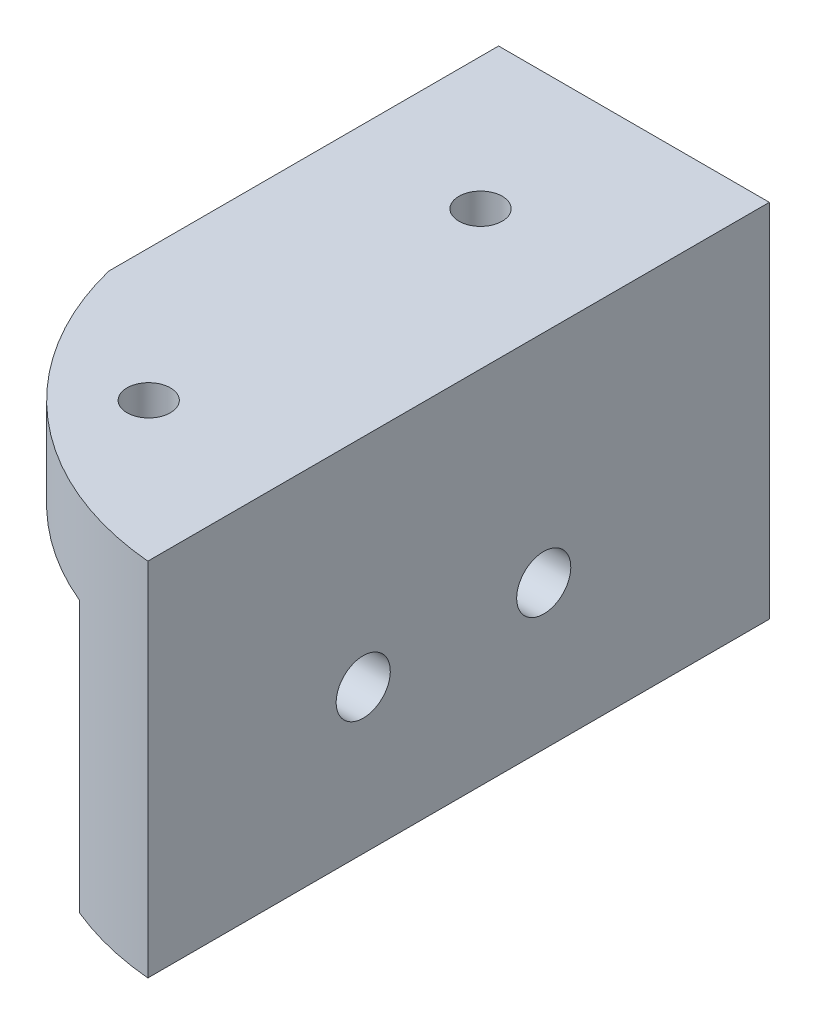
ISO-10303-21;
HEADER;
FILE_DESCRIPTION(('STEP AP214'),'2;1');
FILE_NAME('part.step','',(''),(''),'','','');
FILE_SCHEMA(('AUTOMOTIVE_DESIGN { 1 0 10303 214 1 1 1 1 }'));
ENDSEC;
DATA;
#1=APPLICATION_CONTEXT('core data for automotive mechanical design processes');
#2=APPLICATION_PROTOCOL_DEFINITION('international standard','automotive_design',2000,#1);
#3=PRODUCT_CONTEXT('',#1,'mechanical');
#4=PRODUCT('Part','Part','',(#3));
#5=PRODUCT_RELATED_PRODUCT_CATEGORY('part','',(#4));
#6=PRODUCT_DEFINITION_FORMATION('','',#4);
#7=PRODUCT_DEFINITION_CONTEXT('part definition',#1,'design');
#8=PRODUCT_DEFINITION('design','',#6,#7);
#9=PRODUCT_DEFINITION_SHAPE('','',#8);
#10=(LENGTH_UNIT() NAMED_UNIT(*) SI_UNIT(.MILLI.,.METRE.));
#11=(NAMED_UNIT(*) PLANE_ANGLE_UNIT() SI_UNIT($,.RADIAN.));
#12=(NAMED_UNIT(*) SI_UNIT($,.STERADIAN.) SOLID_ANGLE_UNIT());
#13=UNCERTAINTY_MEASURE_WITH_UNIT(LENGTH_MEASURE(1.E-05),#10,'distance_accuracy_value','');
#14=(GEOMETRIC_REPRESENTATION_CONTEXT(3) GLOBAL_UNCERTAINTY_ASSIGNED_CONTEXT((#13)) GLOBAL_UNIT_ASSIGNED_CONTEXT((#10,
#11,#12)) REPRESENTATION_CONTEXT('',''));
#15=CARTESIAN_POINT('',(0.,0.,0.));
#16=DIRECTION('',(0.,0.,1.));
#17=DIRECTION('',(1.,0.,0.));
#18=AXIS2_PLACEMENT_3D('',#15,#16,#17);
#19=CARTESIAN_POINT('',(5.,0.,35.));
#20=DIRECTION('',(0.,1.,0.));
#21=DIRECTION('',(-1.,0.,0.));
#22=AXIS2_PLACEMENT_3D('',#19,#20,#21);
#23=PLANE('',#22);
#24=DIRECTION('',(1.,0.,0.));
#25=VECTOR('',#24,1.);
#26=CARTESIAN_POINT('',(5.,0.,0.));
#27=LINE('',#26,#25);
#28=CARTESIAN_POINT('',(-5.,0.,0.));
#29=VERTEX_POINT('',#28);
#30=CARTESIAN_POINT('',(0.,0.,0.));
#31=VERTEX_POINT('',#30);
#32=EDGE_CURVE('E40',#29,#31,#27,.T.);
#33=ORIENTED_EDGE('',*,*,#32,.T.);
#34=DIRECTION('',(0.,0.,-1.));
#35=VECTOR('',#34,1.);
#36=CARTESIAN_POINT('',(0.,0.,0.));
#37=LINE('',#36,#35);
#38=CARTESIAN_POINT('',(0.,0.,34.4336942218761));
#39=VERTEX_POINT('',#38);
#40=EDGE_CURVE('E94',#39,#31,#37,.T.);
#41=ORIENTED_EDGE('',*,*,#40,.F.);
#42=CARTESIAN_POINT('',(1.5,0.,17.5));
#43=DIRECTION('',(0.,1.,0.));
#44=DIRECTION('',(-1.,0.,0.));
#45=AXIS2_PLACEMENT_3D('',#42,#43,#44);
#46=CIRCLE('',#45,17.);
#47=CARTESIAN_POINT('',(-5.,0.,33.208278072405));
#48=VERTEX_POINT('',#47);
#49=EDGE_CURVE('E137',#39,#48,#46,.F.);
#50=ORIENTED_EDGE('',*,*,#49,.T.);
#51=DIRECTION('',(0.,0.,-1.));
#52=VECTOR('',#51,1.);
#53=CARTESIAN_POINT('',(-5.,0.,35.));
#54=LINE('',#53,#52);
#55=EDGE_CURVE('E47',#48,#29,#54,.T.);
#56=ORIENTED_EDGE('',*,*,#55,.T.);
#57=EDGE_LOOP('',(#33,#41,#50,#56));
#58=FACE_BOUND('',#57,.T.);
#59=ADVANCED_FACE('F33',(#58),#23,.F.);
#60=CARTESIAN_POINT('',(0.,20.,35.));
#61=DIRECTION('',(0.,-1.,0.));
#62=DIRECTION('',(0.,0.,-1.));
#63=AXIS2_PLACEMENT_3D('',#60,#61,#62);
#64=PLANE('',#63);
#65=CARTESIAN_POINT('',(-7.69238815542512,20.,26.6923881554251));
#66=DIRECTION('',(0.,-1.,0.));
#67=DIRECTION('',(0.,0.,-1.));
#68=AXIS2_PLACEMENT_3D('',#65,#66,#67);
#69=CIRCLE('',#68,1.2);
#70=CARTESIAN_POINT('',(-7.69238815542512,20.,25.4923881554251));
#71=VERTEX_POINT('',#70);
#72=EDGE_CURVE('E120',#71,#71,#69,.T.);
#73=ORIENTED_EDGE('',*,*,#72,.T.);
#74=EDGE_LOOP('',(#73));
#75=FACE_BOUND('',#74,.T.);
#76=CARTESIAN_POINT('',(-7.69238815542512,20.,8.30761184457489));
#77=DIRECTION('',(0.,-1.,0.));
#78=DIRECTION('',(0.,0.,-1.));
#79=AXIS2_PLACEMENT_3D('',#76,#77,#78);
#80=CIRCLE('',#79,1.2);
#81=CARTESIAN_POINT('',(-7.69238815542512,20.,7.10761184457489));
#82=VERTEX_POINT('',#81);
#83=EDGE_CURVE('E160',#82,#82,#80,.T.);
#84=ORIENTED_EDGE('',*,*,#83,.T.);
#85=EDGE_LOOP('',(#84));
#86=FACE_BOUND('',#85,.T.);
#87=CARTESIAN_POINT('',(1.5,20.,17.5));
#88=DIRECTION('',(0.,1.,0.));
#89=DIRECTION('',(0.,0.,-1.));
#90=AXIS2_PLACEMENT_3D('',#87,#88,#89);
#91=CIRCLE('',#90,17.);
#92=CARTESIAN_POINT('',(-15.,20.,21.5926763859362));
#93=VERTEX_POINT('',#92);
#94=CARTESIAN_POINT('',(0.,20.,34.4336942218761));
#95=VERTEX_POINT('',#94);
#96=EDGE_CURVE('E104',#93,#95,#91,.T.);
#97=ORIENTED_EDGE('',*,*,#96,.T.);
#98=DIRECTION('',(0.,0.,1.));
#99=VECTOR('',#98,1.);
#100=CARTESIAN_POINT('',(0.,20.,0.));
#101=LINE('',#100,#99);
#102=CARTESIAN_POINT('',(0.,20.,0.));
#103=VERTEX_POINT('',#102);
#104=EDGE_CURVE('E91',#103,#95,#101,.T.);
#105=ORIENTED_EDGE('',*,*,#104,.F.);
#106=DIRECTION('',(-1.,0.,0.));
#107=VECTOR('',#106,1.);
#108=CARTESIAN_POINT('',(0.,20.,0.));
#109=LINE('',#108,#107);
#110=CARTESIAN_POINT('',(-15.,20.,0.));
#111=VERTEX_POINT('',#110);
#112=EDGE_CURVE('E11',#103,#111,#109,.T.);
#113=ORIENTED_EDGE('',*,*,#112,.T.);
#114=DIRECTION('',(0.,0.,-1.));
#115=VECTOR('',#114,1.);
#116=CARTESIAN_POINT('',(-15.,20.,35.));
#117=LINE('',#116,#115);
#118=EDGE_CURVE('E129',#93,#111,#117,.T.);
#119=ORIENTED_EDGE('',*,*,#118,.F.);
#120=EDGE_LOOP('',(#97,#105,#113,#119));
#121=FACE_BOUND('',#120,.T.);
#122=ADVANCED_FACE('F101',(#75,#86,#121),#64,.F.);
#123=CARTESIAN_POINT('',(-5.,15.,35.));
#124=DIRECTION('',(-1.,0.,0.));
#125=DIRECTION('',(0.,-1.,0.));
#126=AXIS2_PLACEMENT_3D('',#123,#124,#125);
#127=PLANE('',#126);
#128=CARTESIAN_POINT('',(-5.,8.,12.5));
#129=DIRECTION('',(1.,0.,0.));
#130=DIRECTION('',(0.,1.,0.));
#131=AXIS2_PLACEMENT_3D('',#128,#129,#130);
#132=CIRCLE('',#131,1.5);
#133=CARTESIAN_POINT('',(-5.,9.5,12.5));
#134=VERTEX_POINT('',#133);
#135=EDGE_CURVE('E154',#134,#134,#132,.T.);
#136=ORIENTED_EDGE('',*,*,#135,.T.);
#137=EDGE_LOOP('',(#136));
#138=FACE_BOUND('',#137,.T.);
#139=CARTESIAN_POINT('',(-5.,8.,22.5));
#140=DIRECTION('',(1.,0.,0.));
#141=DIRECTION('',(0.,1.,0.));
#142=AXIS2_PLACEMENT_3D('',#139,#140,#141);
#143=CIRCLE('',#142,1.5);
#144=CARTESIAN_POINT('',(-5.,9.5,22.5));
#145=VERTEX_POINT('',#144);
#146=EDGE_CURVE('E157',#145,#145,#143,.T.);
#147=ORIENTED_EDGE('',*,*,#146,.T.);
#148=EDGE_LOOP('',(#147));
#149=FACE_BOUND('',#148,.T.);
#150=ORIENTED_EDGE('',*,*,#55,.F.);
#151=DIRECTION('',(0.,1.,0.));
#152=VECTOR('',#151,1.);
#153=CARTESIAN_POINT('',(-5.,-0.00100000000000062,33.208278072405));
#154=LINE('',#153,#152);
#155=CARTESIAN_POINT('',(-5.,15.,33.208278072405));
#156=VERTEX_POINT('',#155);
#157=EDGE_CURVE('E134',#156,#48,#154,.F.);
#158=ORIENTED_EDGE('',*,*,#157,.F.);
#159=DIRECTION('',(0.,0.,-1.));
#160=VECTOR('',#159,1.);
#161=CARTESIAN_POINT('',(-5.,15.,35.));
#162=LINE('',#161,#160);
#163=CARTESIAN_POINT('',(-5.,15.,0.));
#164=VERTEX_POINT('',#163);
#165=EDGE_CURVE('E55',#156,#164,#162,.T.);
#166=ORIENTED_EDGE('',*,*,#165,.T.);
#167=DIRECTION('',(0.,1.,0.));
#168=VECTOR('',#167,1.);
#169=CARTESIAN_POINT('',(-5.,15.,0.));
#170=LINE('',#169,#168);
#171=EDGE_CURVE('E117',#29,#164,#170,.T.);
#172=ORIENTED_EDGE('',*,*,#171,.F.);
#173=EDGE_LOOP('',(#150,#158,#166,#172));
#174=FACE_BOUND('',#173,.T.);
#175=ADVANCED_FACE('F133',(#138,#149,#174),#127,.T.);
#176=CARTESIAN_POINT('',(-15.,15.,35.));
#177=DIRECTION('',(0.,-1.,0.));
#178=DIRECTION('',(1.,0.,0.));
#179=AXIS2_PLACEMENT_3D('',#176,#177,#178);
#180=PLANE('',#179);
#181=CARTESIAN_POINT('',(-7.69238815542512,15.,8.30761184457489));
#182=DIRECTION('',(0.,1.,0.));
#183=DIRECTION('',(-1.,0.,0.));
#184=AXIS2_PLACEMENT_3D('',#181,#182,#183);
#185=CIRCLE('',#184,1.2);
#186=CARTESIAN_POINT('',(-8.89238815542512,15.,8.30761184457489));
#187=VERTEX_POINT('',#186);
#188=EDGE_CURVE('E161',#187,#187,#185,.T.);
#189=ORIENTED_EDGE('',*,*,#188,.T.);
#190=EDGE_LOOP('',(#189));
#191=FACE_BOUND('',#190,.T.);
#192=CARTESIAN_POINT('',(-7.69238815542512,15.,26.6923881554251));
#193=DIRECTION('',(0.,1.,0.));
#194=DIRECTION('',(-1.,0.,0.));
#195=AXIS2_PLACEMENT_3D('',#192,#193,#194);
#196=CIRCLE('',#195,1.2);
#197=CARTESIAN_POINT('',(-8.89238815542512,15.,26.6923881554251));
#198=VERTEX_POINT('',#197);
#199=EDGE_CURVE('E115',#198,#198,#196,.T.);
#200=ORIENTED_EDGE('',*,*,#199,.T.);
#201=EDGE_LOOP('',(#200));
#202=FACE_BOUND('',#201,.T.);
#203=ORIENTED_EDGE('',*,*,#165,.F.);
#204=CARTESIAN_POINT('',(1.5,15.,17.5));
#205=DIRECTION('',(0.,-1.,0.));
#206=DIRECTION('',(1.,0.,0.));
#207=AXIS2_PLACEMENT_3D('',#204,#205,#206);
#208=CIRCLE('',#207,17.);
#209=CARTESIAN_POINT('',(-15.,15.,21.5926763859362));
#210=VERTEX_POINT('',#209);
#211=EDGE_CURVE('E136',#210,#156,#208,.F.);
#212=ORIENTED_EDGE('',*,*,#211,.F.);
#213=DIRECTION('',(0.,0.,-1.));
#214=VECTOR('',#213,1.);
#215=CARTESIAN_POINT('',(-15.,15.,35.));
#216=LINE('',#215,#214);
#217=CARTESIAN_POINT('',(-15.,15.,0.));
#218=VERTEX_POINT('',#217);
#219=EDGE_CURVE('E127',#210,#218,#216,.T.);
#220=ORIENTED_EDGE('',*,*,#219,.T.);
#221=DIRECTION('',(-1.,0.,0.));
#222=VECTOR('',#221,1.);
#223=CARTESIAN_POINT('',(-15.,15.,0.));
#224=LINE('',#223,#222);
#225=EDGE_CURVE('E112',#164,#218,#224,.T.);
#226=ORIENTED_EDGE('',*,*,#225,.F.);
#227=EDGE_LOOP('',(#203,#212,#220,#226));
#228=FACE_BOUND('',#227,.T.);
#229=ADVANCED_FACE('F141',(#191,#202,#228),#180,.T.);
#230=CARTESIAN_POINT('',(-15.,20.,35.));
#231=DIRECTION('',(-1.,0.,0.));
#232=DIRECTION('',(0.,-1.,0.));
#233=AXIS2_PLACEMENT_3D('',#230,#231,#232);
#234=PLANE('',#233);
#235=ORIENTED_EDGE('',*,*,#219,.F.);
#236=DIRECTION('',(0.,1.,0.));
#237=VECTOR('',#236,1.);
#238=CARTESIAN_POINT('',(-15.,-0.00100000000000672,21.5926763859363));
#239=LINE('',#238,#237);
#240=EDGE_CURVE('E144',#93,#210,#239,.F.);
#241=ORIENTED_EDGE('',*,*,#240,.F.);
#242=ORIENTED_EDGE('',*,*,#118,.T.);
#243=DIRECTION('',(0.,1.,0.));
#244=VECTOR('',#243,1.);
#245=CARTESIAN_POINT('',(-15.,20.,0.));
#246=LINE('',#245,#244);
#247=EDGE_CURVE('E110',#218,#111,#246,.T.);
#248=ORIENTED_EDGE('',*,*,#247,.F.);
#249=EDGE_LOOP('',(#235,#241,#242,#248));
#250=FACE_BOUND('',#249,.T.);
#251=ADVANCED_FACE('F143',(#250),#234,.T.);
#252=CARTESIAN_POINT('',(0.,0.,0.));
#253=DIRECTION('',(0.,0.,-1.));
#254=DIRECTION('',(-1.,0.,0.));
#255=AXIS2_PLACEMENT_3D('',#252,#253,#254);
#256=PLANE('',#255);
#257=DIRECTION('',(0.,1.,0.));
#258=VECTOR('',#257,1.);
#259=CARTESIAN_POINT('',(0.,-0.001000000000001,0.));
#260=LINE('',#259,#258);
#261=EDGE_CURVE('E87',#31,#103,#260,.T.);
#262=ORIENTED_EDGE('',*,*,#261,.F.);
#263=ORIENTED_EDGE('',*,*,#32,.F.);
#264=ORIENTED_EDGE('',*,*,#171,.T.);
#265=ORIENTED_EDGE('',*,*,#225,.T.);
#266=ORIENTED_EDGE('',*,*,#247,.T.);
#267=ORIENTED_EDGE('',*,*,#112,.F.);
#268=EDGE_LOOP('',(#262,#263,#264,#265,#266,#267));
#269=FACE_BOUND('',#268,.T.);
#270=ADVANCED_FACE('F107',(#269),#256,.T.);
#271=CARTESIAN_POINT('',(-0.001000000000001,8.,22.5));
#272=DIRECTION('',(1.,0.,0.));
#273=DIRECTION('',(0.,1.,0.));
#274=AXIS2_PLACEMENT_3D('',#271,#272,#273);
#275=CYLINDRICAL_SURFACE('',#274,1.5);
#276=CARTESIAN_POINT('',(0.,8.,22.5));
#277=DIRECTION('',(-1.,0.,0.));
#278=DIRECTION('',(0.,0.,1.));
#279=AXIS2_PLACEMENT_3D('',#276,#277,#278);
#280=CIRCLE('',#279,1.5);
#281=CARTESIAN_POINT('',(0.,8.,24.));
#282=VERTEX_POINT('',#281);
#283=EDGE_CURVE('E145',#282,#282,#280,.T.);
#284=ORIENTED_EDGE('',*,*,#283,.F.);
#285=EDGE_LOOP('',(#284));
#286=FACE_BOUND('',#285,.T.);
#287=ORIENTED_EDGE('',*,*,#146,.F.);
#288=EDGE_LOOP('',(#287));
#289=FACE_BOUND('',#288,.T.);
#290=ADVANCED_FACE('F197',(#286,#289),#275,.F.);
#291=CARTESIAN_POINT('',(-0.001000000000001,8.,12.5));
#292=DIRECTION('',(1.,0.,0.));
#293=DIRECTION('',(0.,1.,0.));
#294=AXIS2_PLACEMENT_3D('',#291,#292,#293);
#295=CYLINDRICAL_SURFACE('',#294,1.5);
#296=CARTESIAN_POINT('',(0.,8.,12.5));
#297=DIRECTION('',(-1.,0.,0.));
#298=DIRECTION('',(0.,0.,1.));
#299=AXIS2_PLACEMENT_3D('',#296,#297,#298);
#300=CIRCLE('',#299,1.5);
#301=CARTESIAN_POINT('',(0.,8.,14.));
#302=VERTEX_POINT('',#301);
#303=EDGE_CURVE('E97',#302,#302,#300,.T.);
#304=ORIENTED_EDGE('',*,*,#303,.F.);
#305=EDGE_LOOP('',(#304));
#306=FACE_BOUND('',#305,.T.);
#307=ORIENTED_EDGE('',*,*,#135,.F.);
#308=EDGE_LOOP('',(#307));
#309=FACE_BOUND('',#308,.T.);
#310=ADVANCED_FACE('F179',(#306,#309),#295,.F.);
#311=CARTESIAN_POINT('',(-7.69238815542512,20.001,26.6923881554251));
#312=DIRECTION('',(0.,-1.,0.));
#313=DIRECTION('',(1.,0.,0.));
#314=AXIS2_PLACEMENT_3D('',#311,#312,#313);
#315=CYLINDRICAL_SURFACE('',#314,1.2);
#316=ORIENTED_EDGE('',*,*,#199,.F.);
#317=EDGE_LOOP('',(#316));
#318=FACE_BOUND('',#317,.T.);
#319=ORIENTED_EDGE('',*,*,#72,.F.);
#320=EDGE_LOOP('',(#319));
#321=FACE_BOUND('',#320,.T.);
#322=ADVANCED_FACE('F171',(#318,#321),#315,.F.);
#323=CARTESIAN_POINT('',(-7.69238815542512,20.001,8.30761184457489));
#324=DIRECTION('',(0.,-1.,0.));
#325=DIRECTION('',(1.,0.,0.));
#326=AXIS2_PLACEMENT_3D('',#323,#324,#325);
#327=CYLINDRICAL_SURFACE('',#326,1.2);
#328=ORIENTED_EDGE('',*,*,#188,.F.);
#329=EDGE_LOOP('',(#328));
#330=FACE_BOUND('',#329,.T.);
#331=ORIENTED_EDGE('',*,*,#83,.F.);
#332=EDGE_LOOP('',(#331));
#333=FACE_BOUND('',#332,.T.);
#334=ADVANCED_FACE('F168',(#330,#333),#327,.F.);
#335=CARTESIAN_POINT('',(1.5,-0.001000000000001,17.5));
#336=DIRECTION('',(0.,1.,0.));
#337=DIRECTION('',(0.,0.,1.));
#338=AXIS2_PLACEMENT_3D('',#335,#336,#337);
#339=CYLINDRICAL_SURFACE('',#338,17.);
#340=ORIENTED_EDGE('',*,*,#240,.T.);
#341=ORIENTED_EDGE('',*,*,#211,.T.);
#342=ORIENTED_EDGE('',*,*,#157,.T.);
#343=ORIENTED_EDGE('',*,*,#49,.F.);
#344=DIRECTION('',(0.,1.,0.));
#345=VECTOR('',#344,1.);
#346=CARTESIAN_POINT('',(0.,-0.001000000000001,34.4336942218761));
#347=LINE('',#346,#345);
#348=EDGE_CURVE('E131',#95,#39,#347,.F.);
#349=ORIENTED_EDGE('',*,*,#348,.F.);
#350=ORIENTED_EDGE('',*,*,#96,.F.);
#351=EDGE_LOOP('',(#340,#341,#342,#343,#349,#350));
#352=FACE_BOUND('',#351,.T.);
#353=ADVANCED_FACE('F170',(#352),#339,.T.);
#354=CARTESIAN_POINT('',(0.,-0.001000000000001,0.));
#355=DIRECTION('',(-1.,0.,0.));
#356=DIRECTION('',(0.,0.,1.));
#357=AXIS2_PLACEMENT_3D('',#354,#355,#356);
#358=PLANE('',#357);
#359=ORIENTED_EDGE('',*,*,#40,.T.);
#360=ORIENTED_EDGE('',*,*,#261,.T.);
#361=ORIENTED_EDGE('',*,*,#104,.T.);
#362=ORIENTED_EDGE('',*,*,#348,.T.);
#363=EDGE_LOOP('',(#359,#360,#361,#362));
#364=FACE_BOUND('',#363,.T.);
#365=ORIENTED_EDGE('',*,*,#303,.T.);
#366=EDGE_LOOP('',(#365));
#367=FACE_BOUND('',#366,.T.);
#368=ORIENTED_EDGE('',*,*,#283,.T.);
#369=EDGE_LOOP('',(#368));
#370=FACE_BOUND('',#369,.T.);
#371=ADVANCED_FACE('F89',(#364,#367,#370),#358,.F.);
#372=CLOSED_SHELL('',(#59,#122,#175,#229,#251,#270,#290,#310,#322,#334,#353,#371));
#373=MANIFOLD_SOLID_BREP('B2',#372);
#374=ADVANCED_BREP_SHAPE_REPRESENTATION('',(#18,#373),#14);
#375=SHAPE_DEFINITION_REPRESENTATION(#9,#374);
ENDSEC;
END-ISO-10303-21;
